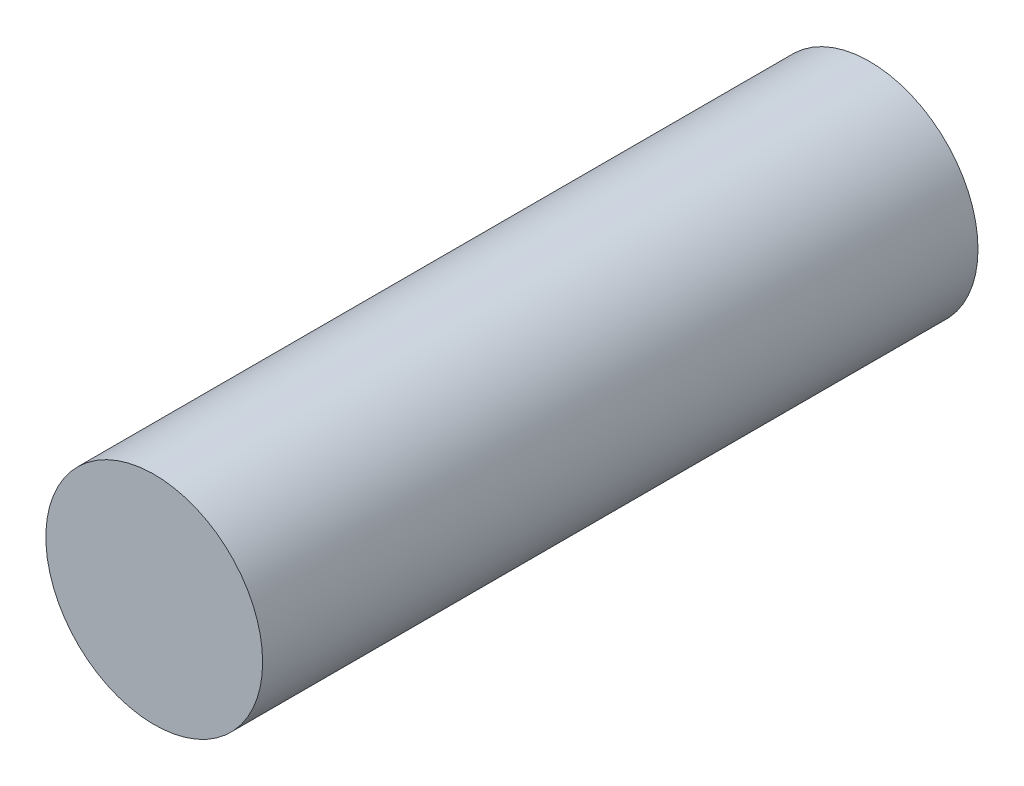
ISO-10303-21;
HEADER;
FILE_DESCRIPTION(('STEP AP214'),'2;1');
FILE_NAME('part.step','',(''),(''),'','','');
FILE_SCHEMA(('AUTOMOTIVE_DESIGN { 1 0 10303 214 1 1 1 1 }'));
ENDSEC;
DATA;
#1=APPLICATION_CONTEXT('core data for automotive mechanical design processes');
#2=APPLICATION_PROTOCOL_DEFINITION('international standard','automotive_design',2000,#1);
#3=PRODUCT_CONTEXT('',#1,'mechanical');
#4=PRODUCT('Part','Part','',(#3));
#5=PRODUCT_RELATED_PRODUCT_CATEGORY('part','',(#4));
#6=PRODUCT_DEFINITION_FORMATION('','',#4);
#7=PRODUCT_DEFINITION_CONTEXT('part definition',#1,'design');
#8=PRODUCT_DEFINITION('design','',#6,#7);
#9=PRODUCT_DEFINITION_SHAPE('','',#8);
#10=(LENGTH_UNIT() NAMED_UNIT(*) SI_UNIT(.MILLI.,.METRE.));
#11=(NAMED_UNIT(*) PLANE_ANGLE_UNIT() SI_UNIT($,.RADIAN.));
#12=(NAMED_UNIT(*) SI_UNIT($,.STERADIAN.) SOLID_ANGLE_UNIT());
#13=UNCERTAINTY_MEASURE_WITH_UNIT(LENGTH_MEASURE(1.E-05),#10,'distance_accuracy_value','');
#14=(GEOMETRIC_REPRESENTATION_CONTEXT(3) GLOBAL_UNCERTAINTY_ASSIGNED_CONTEXT((#13)) GLOBAL_UNIT_ASSIGNED_CONTEXT((#10,
#11,#12)) REPRESENTATION_CONTEXT('',''));
#15=CARTESIAN_POINT('',(0.,0.,0.));
#16=DIRECTION('',(0.,0.,1.));
#17=DIRECTION('',(1.,0.,0.));
#18=AXIS2_PLACEMENT_3D('',#15,#16,#17);
#19=CARTESIAN_POINT('',(0.,0.,41.91));
#20=DIRECTION('',(0.,0.,-1.));
#21=DIRECTION('',(-1.,0.,0.));
#22=AXIS2_PLACEMENT_3D('',#19,#20,#21);
#23=CYLINDRICAL_SURFACE('',#22,6.35);
#24=CARTESIAN_POINT('',(0.,0.,41.91));
#25=DIRECTION('',(0.,0.,1.));
#26=DIRECTION('',(1.,0.,0.));
#27=AXIS2_PLACEMENT_3D('',#24,#25,#26);
#28=CIRCLE('',#27,6.35);
#29=CARTESIAN_POINT('',(6.35,0.,41.91));
#30=VERTEX_POINT('',#29);
#31=EDGE_CURVE('E10',#30,#30,#28,.T.);
#32=ORIENTED_EDGE('',*,*,#31,.F.);
#33=EDGE_LOOP('',(#32));
#34=FACE_BOUND('',#33,.T.);
#35=CARTESIAN_POINT('',(0.,0.,0.));
#36=DIRECTION('',(0.,0.,1.));
#37=DIRECTION('',(1.,0.,0.));
#38=AXIS2_PLACEMENT_3D('',#35,#36,#37);
#39=CIRCLE('',#38,6.35);
#40=CARTESIAN_POINT('',(6.35,0.,0.));
#41=VERTEX_POINT('',#40);
#42=EDGE_CURVE('E40',#41,#41,#39,.T.);
#43=ORIENTED_EDGE('',*,*,#42,.T.);
#44=EDGE_LOOP('',(#43));
#45=FACE_BOUND('',#44,.T.);
#46=ADVANCED_FACE('F37',(#34,#45),#23,.T.);
#47=CARTESIAN_POINT('',(0.,0.,41.91));
#48=DIRECTION('',(0.,0.,1.));
#49=DIRECTION('',(1.,0.,0.));
#50=AXIS2_PLACEMENT_3D('',#47,#48,#49);
#51=PLANE('',#50);
#52=ORIENTED_EDGE('',*,*,#31,.T.);
#53=EDGE_LOOP('',(#52));
#54=FACE_BOUND('',#53,.T.);
#55=ADVANCED_FACE('F54',(#54),#51,.T.);
#56=CARTESIAN_POINT('',(0.,0.,0.));
#57=DIRECTION('',(0.,0.,1.));
#58=DIRECTION('',(1.,0.,0.));
#59=AXIS2_PLACEMENT_3D('',#56,#57,#58);
#60=PLANE('',#59);
#61=ORIENTED_EDGE('',*,*,#42,.F.);
#62=EDGE_LOOP('',(#61));
#63=FACE_BOUND('',#62,.T.);
#64=ADVANCED_FACE('F52',(#63),#60,.F.);
#65=CLOSED_SHELL('',(#46,#55,#64));
#66=MANIFOLD_SOLID_BREP('B2',#65);
#67=ADVANCED_BREP_SHAPE_REPRESENTATION('',(#18,#66),#14);
#68=SHAPE_DEFINITION_REPRESENTATION(#9,#67);
ENDSEC;
END-ISO-10303-21;
